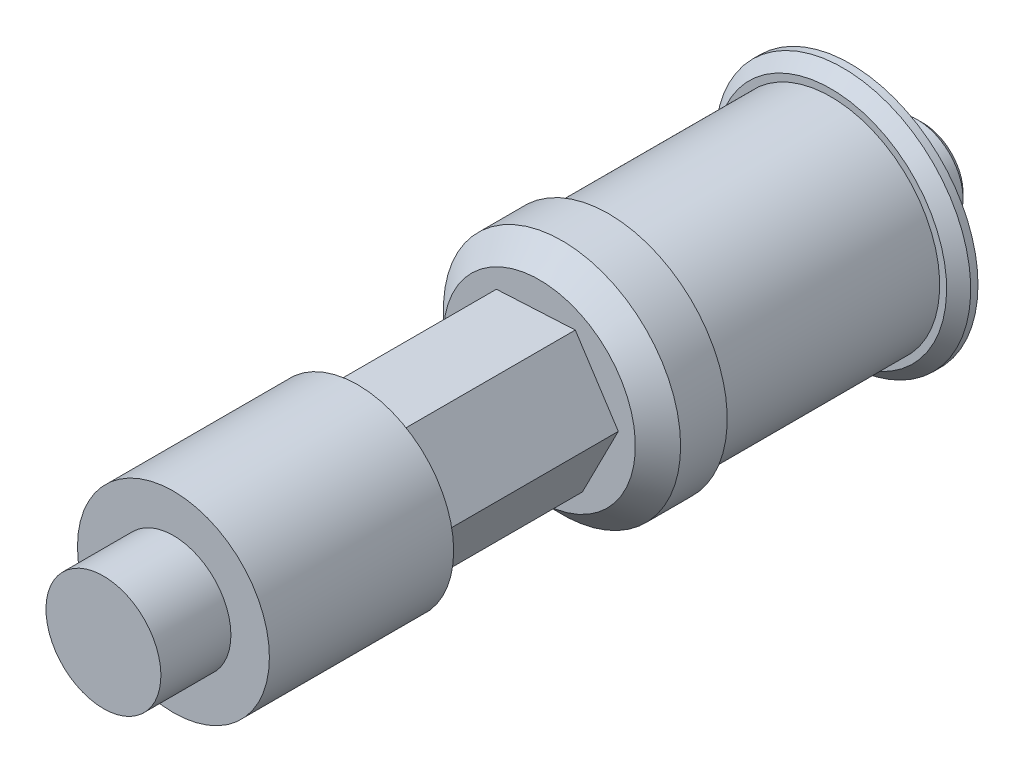
ISO-10303-21;
HEADER;
FILE_DESCRIPTION(('STEP AP214'),'2;1');
FILE_NAME('part.step','',(''),(''),'','','');
FILE_SCHEMA(('AUTOMOTIVE_DESIGN { 1 0 10303 214 1 1 1 1 }'));
ENDSEC;
DATA;
#1=APPLICATION_CONTEXT('core data for automotive mechanical design processes');
#2=APPLICATION_PROTOCOL_DEFINITION('international standard','automotive_design',2000,#1);
#3=PRODUCT_CONTEXT('',#1,'mechanical');
#4=PRODUCT('Part','Part','',(#3));
#5=PRODUCT_RELATED_PRODUCT_CATEGORY('part','',(#4));
#6=PRODUCT_DEFINITION_FORMATION('','',#4);
#7=PRODUCT_DEFINITION_CONTEXT('part definition',#1,'design');
#8=PRODUCT_DEFINITION('design','',#6,#7);
#9=PRODUCT_DEFINITION_SHAPE('','',#8);
#10=(LENGTH_UNIT() NAMED_UNIT(*) SI_UNIT(.MILLI.,.METRE.));
#11=(NAMED_UNIT(*) PLANE_ANGLE_UNIT() SI_UNIT($,.RADIAN.));
#12=(NAMED_UNIT(*) SI_UNIT($,.STERADIAN.) SOLID_ANGLE_UNIT());
#13=UNCERTAINTY_MEASURE_WITH_UNIT(LENGTH_MEASURE(1.E-05),#10,'distance_accuracy_value','');
#14=(GEOMETRIC_REPRESENTATION_CONTEXT(3) GLOBAL_UNCERTAINTY_ASSIGNED_CONTEXT((#13)) GLOBAL_UNIT_ASSIGNED_CONTEXT((#10,
#11,#12)) REPRESENTATION_CONTEXT('',''));
#15=CARTESIAN_POINT('',(0.,0.,0.));
#16=DIRECTION('',(0.,0.,1.));
#17=DIRECTION('',(1.,0.,0.));
#18=AXIS2_PLACEMENT_3D('',#15,#16,#17);
#19=CARTESIAN_POINT('',(-77.2504091626865,123.55655672875,3.32914742607242));
#20=DIRECTION('',(0.,0.,1.));
#21=DIRECTION('',(-0.998640809167126,-0.0521203824432134,0.));
#22=AXIS2_PLACEMENT_3D('',#19,#20,#21);
#23=CYLINDRICAL_SURFACE('',#22,4.699);
#24=CARTESIAN_POINT('',(-77.2504091626865,123.55655672875,39.3573));
#25=DIRECTION('',(0.,0.,-1.));
#26=DIRECTION('',(-0.998640809167126,-0.0521203824432134,0.));
#27=AXIS2_PLACEMENT_3D('',#24,#25,#26);
#28=CIRCLE('',#27,4.699);
#29=CARTESIAN_POINT('',(-81.9430223249628,123.311643051649,39.3573));
#30=VERTEX_POINT('',#29);
#31=EDGE_CURVE('E204',#30,#30,#28,.T.);
#32=ORIENTED_EDGE('',*,*,#31,.F.);
#33=EDGE_LOOP('',(#32));
#34=FACE_BOUND('',#33,.T.);
#35=CARTESIAN_POINT('',(-77.2504091626865,123.55655672875,39.5605));
#36=DIRECTION('',(0.,0.,1.));
#37=DIRECTION('',(1.,0.,0.));
#38=AXIS2_PLACEMENT_3D('',#35,#36,#37);
#39=CIRCLE('',#38,4.699);
#40=CARTESIAN_POINT('',(-72.5514091626865,123.55655672875,39.5605));
#41=VERTEX_POINT('',#40);
#42=EDGE_CURVE('E22',#41,#41,#39,.F.);
#43=ORIENTED_EDGE('',*,*,#42,.T.);
#44=EDGE_LOOP('',(#43));
#45=FACE_BOUND('',#44,.T.);
#46=ADVANCED_FACE('F18',(#34,#45),#23,.T.);
#47=CARTESIAN_POINT('',(-77.2504091626865,123.55655672875,22.0909));
#48=DIRECTION('',(0.,0.,1.));
#49=DIRECTION('',(-0.998640809167126,-0.0521203824432134,0.));
#50=AXIS2_PLACEMENT_3D('',#47,#48,#49);
#51=PLANE('',#50);
#52=CARTESIAN_POINT('',(-77.2504091626865,123.55655672875,22.0909));
#53=DIRECTION('',(0.,0.,-1.));
#54=DIRECTION('',(-0.998640809167126,-0.0521203824432134,0.));
#55=AXIS2_PLACEMENT_3D('',#52,#53,#54);
#56=CIRCLE('',#55,7.5692);
#57=CARTESIAN_POINT('',(-84.8093211754343,123.162047129961,22.0909));
#58=VERTEX_POINT('',#57);
#59=EDGE_CURVE('E187',#58,#58,#56,.T.);
#60=ORIENTED_EDGE('',*,*,#59,.F.);
#61=EDGE_LOOP('',(#60));
#62=FACE_BOUND('',#61,.T.);
#63=CARTESIAN_POINT('',(-77.2504091626865,123.55655672875,22.0909));
#64=DIRECTION('',(0.,0.,1.));
#65=DIRECTION('',(-0.998640809167126,-0.0521203824432134,0.));
#66=AXIS2_PLACEMENT_3D('',#63,#64,#65);
#67=CIRCLE('',#66,8.255);
#68=CARTESIAN_POINT('',(-85.4941890423611,123.126302971681,22.0909));
#69=VERTEX_POINT('',#68);
#70=EDGE_CURVE('E175',#69,#69,#67,.T.);
#71=ORIENTED_EDGE('',*,*,#70,.F.);
#72=EDGE_LOOP('',(#71));
#73=FACE_BOUND('',#72,.T.);
#74=ADVANCED_FACE('F270',(#62,#73),#51,.F.);
#75=CARTESIAN_POINT('',(-77.2504091626865,123.55655672875,57.260499906));
#76=DIRECTION('',(0.,0.,1.));
#77=DIRECTION('',(-0.998640809167126,-0.0521203824432134,0.));
#78=AXIS2_PLACEMENT_3D('',#75,#76,#77);
#79=CYLINDRICAL_SURFACE('',#78,8.255);
#80=CARTESIAN_POINT('',(-77.2504091626865,123.55655672875,25.3365));
#81=DIRECTION('',(0.,0.,1.));
#82=DIRECTION('',(0.0521203824432135,-0.998640809167127,0.));
#83=AXIS2_PLACEMENT_3D('',#80,#81,#82);
#84=CIRCLE('',#83,8.255);
#85=CARTESIAN_POINT('',(-76.8201554056178,115.312776849075,25.3365));
#86=VERTEX_POINT('',#85);
#87=EDGE_CURVE('E177',#86,#86,#84,.T.);
#88=ORIENTED_EDGE('',*,*,#87,.F.);
#89=EDGE_LOOP('',(#88));
#90=FACE_BOUND('',#89,.T.);
#91=ORIENTED_EDGE('',*,*,#70,.T.);
#92=EDGE_LOOP('',(#91));
#93=FACE_BOUND('',#92,.T.);
#94=ADVANCED_FACE('F262',(#90,#93),#79,.T.);
#95=CARTESIAN_POINT('',(-77.2504091626865,123.55655672875,25.3365));
#96=DIRECTION('',(0.,0.,-1.));
#97=DIRECTION('',(-0.0521203824432135,0.998640809167127,0.));
#98=AXIS2_PLACEMENT_3D('',#95,#96,#97);
#99=CONICAL_SURFACE('',#98,8.255,0.785398163397449);
#100=ORIENTED_EDGE('',*,*,#87,.T.);
#101=EDGE_LOOP('',(#100));
#102=FACE_BOUND('',#101,.T.);
#103=CARTESIAN_POINT('',(-77.2504091626865,123.55655672875,26.9113));
#104=DIRECTION('',(0.,0.,1.));
#105=DIRECTION('',(0.0521203824432135,-0.998640809167127,0.));
#106=AXIS2_PLACEMENT_3D('',#103,#104,#105);
#107=CIRCLE('',#106,6.6802);
#108=CARTESIAN_POINT('',(-76.9022345838893,116.885436395352,26.9113));
#109=VERTEX_POINT('',#108);
#110=EDGE_CURVE('E182',#109,#109,#107,.T.);
#111=ORIENTED_EDGE('',*,*,#110,.F.);
#112=EDGE_LOOP('',(#111));
#113=FACE_BOUND('',#112,.T.);
#114=ADVANCED_FACE('F259',(#102,#113),#99,.T.);
#115=CARTESIAN_POINT('',(-74.1896879220587,119.074490707315,3.32914742607242));
#116=DIRECTION('',(0.890908501216186,-0.45418282933278,0.));
#117=DIRECTION('',(0.45418282933278,0.890908501216187,0.));
#118=AXIS2_PLACEMENT_3D('',#115,#116,#117);
#119=PLANE('',#118);
#120=DIRECTION('',(-0.45418282933278,-0.890908501216187,0.));
#121=VECTOR('',#120,1.);
#122=CARTESIAN_POINT('',(-74.1896879220587,119.074490707315,26.9113));
#123=LINE('',#122,#121);
#124=CARTESIAN_POINT('',(-71.7586223942209,123.843180331592,26.9113));
#125=VERTEX_POINT('',#124);
#126=CARTESIAN_POINT('',(-74.2562924570679,118.943841676513,26.9113));
#127=VERTEX_POINT('',#126);
#128=EDGE_CURVE('E44',#125,#127,#123,.T.);
#129=ORIENTED_EDGE('',*,*,#128,.F.);
#130=DIRECTION('',(0.,0.,-1.));
#131=VECTOR('',#130,1.);
#132=CARTESIAN_POINT('',(-71.7586223942209,123.843180331592,3.32914742607242));
#133=LINE('',#132,#131);
#134=CARTESIAN_POINT('',(-71.7586223942209,123.843180331592,39.3573));
#135=VERTEX_POINT('',#134);
#136=EDGE_CURVE('E123',#125,#135,#133,.F.);
#137=ORIENTED_EDGE('',*,*,#136,.T.);
#138=DIRECTION('',(-0.45418282933278,-0.890908501216187,0.));
#139=VECTOR('',#138,1.);
#140=CARTESIAN_POINT('',(-74.1896879220587,119.074490707315,39.3573));
#141=LINE('',#140,#139);
#142=CARTESIAN_POINT('',(-74.2562924570679,118.943841676513,39.3573));
#143=VERTEX_POINT('',#142);
#144=EDGE_CURVE('E36',#135,#143,#141,.T.);
#145=ORIENTED_EDGE('',*,*,#144,.T.);
#146=DIRECTION('',(0.,0.,-1.));
#147=VECTOR('',#146,1.);
#148=CARTESIAN_POINT('',(-74.2562924570679,118.943841676513,3.32914742607242));
#149=LINE('',#148,#147);
#150=EDGE_CURVE('E128',#127,#143,#149,.F.);
#151=ORIENTED_EDGE('',*,*,#150,.F.);
#152=EDGE_LOOP('',(#129,#137,#145,#151));
#153=FACE_BOUND('',#152,.T.);
#154=ADVANCED_FACE('F261',(#153),#119,.T.);
#155=CARTESIAN_POINT('',(-83.3381235353693,123.238830877376,26.9113));
#156=DIRECTION('',(0.,0.,1.));
#157=DIRECTION('',(-0.998640809167126,-0.0521203824432134,0.));
#158=AXIS2_PLACEMENT_3D('',#155,#156,#157);
#159=PLANE('',#158);
#160=ORIENTED_EDGE('',*,*,#110,.T.);
#161=EDGE_LOOP('',(#160));
#162=FACE_BOUND('',#161,.T.);
#163=DIRECTION('',(-0.544457979834346,0.838788118772973,0.));
#164=VECTOR('',#163,1.);
#165=CARTESIAN_POINT('',(-82.6623528190023,123.146927391181,26.9113));
#166=LINE('',#165,#164);
#167=CARTESIAN_POINT('',(-79.7480792255335,118.65721807367,26.9113));
#168=VERTEX_POINT('',#167);
#169=CARTESIAN_POINT('',(-82.7421959311521,123.269933125907,26.9113));
#170=VERTEX_POINT('',#169);
#171=EDGE_CURVE('E77',#168,#170,#166,.T.);
#172=ORIENTED_EDGE('',*,*,#171,.T.);
#173=DIRECTION('',(0.45418282933278,0.890908501216187,0.));
#174=VECTOR('',#173,1.);
#175=CARTESIAN_POINT('',(-80.3111304033144,128.038622750185,26.9113));
#176=LINE('',#175,#174);
#177=CARTESIAN_POINT('',(-80.2445258683051,128.169271780987,26.9113));
#178=VERTEX_POINT('',#177);
#179=EDGE_CURVE('E93',#170,#178,#176,.T.);
#180=ORIENTED_EDGE('',*,*,#179,.T.);
#181=DIRECTION('',(0.998640809167126,0.0521203824432137,0.));
#182=VECTOR('',#181,1.);
#183=CARTESIAN_POINT('',(-74.8991867469986,128.448252087754,26.9113));
#184=LINE('',#183,#182);
#185=CARTESIAN_POINT('',(-74.7527390998395,128.45589538383,26.9113));
#186=VERTEX_POINT('',#185);
#187=EDGE_CURVE('E237',#178,#186,#184,.T.);
#188=ORIENTED_EDGE('',*,*,#187,.T.);
#189=DIRECTION('',(0.544457979834346,-0.838788118772973,0.));
#190=VECTOR('',#189,1.);
#191=CARTESIAN_POINT('',(-71.8384655063708,123.966186066319,26.9113));
#192=LINE('',#191,#190);
#193=EDGE_CURVE('E242',#186,#125,#192,.T.);
#194=ORIENTED_EDGE('',*,*,#193,.T.);
#195=ORIENTED_EDGE('',*,*,#128,.T.);
#196=DIRECTION('',(-0.998640809167126,-0.0521203824432132,0.));
#197=VECTOR('',#196,1.);
#198=CARTESIAN_POINT('',(-79.6016315783744,118.664861369746,26.9113));
#199=LINE('',#198,#197);
#200=EDGE_CURVE('E74',#127,#168,#199,.T.);
#201=ORIENTED_EDGE('',*,*,#200,.T.);
#202=EDGE_LOOP('',(#172,#180,#188,#194,#195,#201));
#203=FACE_BOUND('',#202,.T.);
#204=ADVANCED_FACE('F76',(#162,#203),#159,.T.);
#205=CARTESIAN_POINT('',(-79.6016315783744,118.664861369746,3.32914742607242));
#206=DIRECTION('',(0.0521203824432133,-0.998640809167127,0.));
#207=DIRECTION('',(0.998640809167126,0.0521203824432132,0.));
#208=AXIS2_PLACEMENT_3D('',#205,#206,#207);
#209=PLANE('',#208);
#210=ORIENTED_EDGE('',*,*,#200,.F.);
#211=ORIENTED_EDGE('',*,*,#150,.T.);
#212=DIRECTION('',(-0.998640809167126,-0.0521203824432132,0.));
#213=VECTOR('',#212,1.);
#214=CARTESIAN_POINT('',(-79.6016315783744,118.664861369746,39.3573));
#215=LINE('',#214,#213);
#216=CARTESIAN_POINT('',(-79.7480792255335,118.65721807367,39.3573));
#217=VERTEX_POINT('',#216);
#218=EDGE_CURVE('E96',#143,#217,#215,.T.);
#219=ORIENTED_EDGE('',*,*,#218,.T.);
#220=DIRECTION('',(0.,0.,-1.));
#221=VECTOR('',#220,1.);
#222=CARTESIAN_POINT('',(-79.7480792255335,118.65721807367,3.32914742607242));
#223=LINE('',#222,#221);
#224=EDGE_CURVE('E89',#168,#217,#223,.F.);
#225=ORIENTED_EDGE('',*,*,#224,.F.);
#226=EDGE_LOOP('',(#210,#211,#219,#225));
#227=FACE_BOUND('',#226,.T.);
#228=ADVANCED_FACE('F95',(#227),#209,.T.);
#229=CARTESIAN_POINT('',(-83.3381235353693,123.238830877376,39.3573));
#230=DIRECTION('',(0.,0.,1.));
#231=DIRECTION('',(-0.998640809167126,-0.0521203824432134,0.));
#232=AXIS2_PLACEMENT_3D('',#229,#230,#231);
#233=PLANE('',#232);
#234=ORIENTED_EDGE('',*,*,#31,.T.);
#235=EDGE_LOOP('',(#234));
#236=FACE_BOUND('',#235,.T.);
#237=DIRECTION('',(-0.544457979834346,0.838788118772973,0.));
#238=VECTOR('',#237,1.);
#239=CARTESIAN_POINT('',(-82.6623528190022,123.146927391181,39.3573));
#240=LINE('',#239,#238);
#241=CARTESIAN_POINT('',(-82.7421959311521,123.269933125907,39.3573));
#242=VERTEX_POINT('',#241);
#243=EDGE_CURVE('E83',#217,#242,#240,.T.);
#244=ORIENTED_EDGE('',*,*,#243,.F.);
#245=ORIENTED_EDGE('',*,*,#218,.F.);
#246=ORIENTED_EDGE('',*,*,#144,.F.);
#247=DIRECTION('',(0.544457979834346,-0.838788118772973,0.));
#248=VECTOR('',#247,1.);
#249=CARTESIAN_POINT('',(-71.8384655063708,123.966186066319,39.3573));
#250=LINE('',#249,#248);
#251=CARTESIAN_POINT('',(-74.7527390998395,128.45589538383,39.3573));
#252=VERTEX_POINT('',#251);
#253=EDGE_CURVE('E212',#252,#135,#250,.T.);
#254=ORIENTED_EDGE('',*,*,#253,.F.);
#255=DIRECTION('',(0.998640809167126,0.0521203824432137,0.));
#256=VECTOR('',#255,1.);
#257=CARTESIAN_POINT('',(-74.8991867469986,128.448252087754,39.3573));
#258=LINE('',#257,#256);
#259=CARTESIAN_POINT('',(-80.2445258683051,128.169271780987,39.3573));
#260=VERTEX_POINT('',#259);
#261=EDGE_CURVE('E217',#260,#252,#258,.T.);
#262=ORIENTED_EDGE('',*,*,#261,.F.);
#263=DIRECTION('',(0.45418282933278,0.890908501216187,0.));
#264=VECTOR('',#263,1.);
#265=CARTESIAN_POINT('',(-80.3111304033144,128.038622750185,39.3573));
#266=LINE('',#265,#264);
#267=EDGE_CURVE('E222',#242,#260,#266,.T.);
#268=ORIENTED_EDGE('',*,*,#267,.F.);
#269=EDGE_LOOP('',(#244,#245,#246,#254,#262,#268));
#270=FACE_BOUND('',#269,.T.);
#271=ADVANCED_FACE('F284',(#236,#270),#233,.T.);
#272=CARTESIAN_POINT('',(-82.6623528190022,123.146927391181,3.32914742607242));
#273=DIRECTION('',(-0.838788118772972,-0.544457979834347,0.));
#274=DIRECTION('',(0.544457979834346,-0.838788118772973,0.));
#275=AXIS2_PLACEMENT_3D('',#272,#273,#274);
#276=PLANE('',#275);
#277=ORIENTED_EDGE('',*,*,#171,.F.);
#278=ORIENTED_EDGE('',*,*,#224,.T.);
#279=ORIENTED_EDGE('',*,*,#243,.T.);
#280=DIRECTION('',(0.,0.,-1.));
#281=VECTOR('',#280,1.);
#282=CARTESIAN_POINT('',(-82.7421959311521,123.269933125907,3.32914742607242));
#283=LINE('',#282,#281);
#284=EDGE_CURVE('E91',#170,#242,#283,.F.);
#285=ORIENTED_EDGE('',*,*,#284,.F.);
#286=EDGE_LOOP('',(#277,#278,#279,#285));
#287=FACE_BOUND('',#286,.T.);
#288=ADVANCED_FACE('F87',(#287),#276,.T.);
#289=CARTESIAN_POINT('',(-80.3111304033143,128.038622750185,3.32914742607242));
#290=DIRECTION('',(-0.890908501216186,0.45418282933278,0.));
#291=DIRECTION('',(-0.45418282933278,-0.890908501216187,0.));
#292=AXIS2_PLACEMENT_3D('',#289,#290,#291);
#293=PLANE('',#292);
#294=ORIENTED_EDGE('',*,*,#179,.F.);
#295=ORIENTED_EDGE('',*,*,#284,.T.);
#296=ORIENTED_EDGE('',*,*,#267,.T.);
#297=DIRECTION('',(0.,0.,-1.));
#298=VECTOR('',#297,1.);
#299=CARTESIAN_POINT('',(-80.2445258683051,128.169271780987,3.32914742607242));
#300=LINE('',#299,#298);
#301=EDGE_CURVE('E104',#178,#260,#300,.F.);
#302=ORIENTED_EDGE('',*,*,#301,.F.);
#303=EDGE_LOOP('',(#294,#295,#296,#302));
#304=FACE_BOUND('',#303,.T.);
#305=ADVANCED_FACE('F298',(#304),#293,.T.);
#306=CARTESIAN_POINT('',(-74.8991867469986,128.448252087754,3.32914742607242));
#307=DIRECTION('',(-0.0521203824432138,0.998640809167127,0.));
#308=DIRECTION('',(-0.998640809167126,-0.0521203824432137,0.));
#309=AXIS2_PLACEMENT_3D('',#306,#307,#308);
#310=PLANE('',#309);
#311=ORIENTED_EDGE('',*,*,#187,.F.);
#312=ORIENTED_EDGE('',*,*,#301,.T.);
#313=ORIENTED_EDGE('',*,*,#261,.T.);
#314=DIRECTION('',(0.,0.,-1.));
#315=VECTOR('',#314,1.);
#316=CARTESIAN_POINT('',(-74.7527390998395,128.45589538383,3.32914742607242));
#317=LINE('',#316,#315);
#318=EDGE_CURVE('E117',#186,#252,#317,.F.);
#319=ORIENTED_EDGE('',*,*,#318,.F.);
#320=EDGE_LOOP('',(#311,#312,#313,#319));
#321=FACE_BOUND('',#320,.T.);
#322=ADVANCED_FACE('F294',(#321),#310,.T.);
#323=CARTESIAN_POINT('',(-71.8384655063708,123.966186066319,3.32914742607242));
#324=DIRECTION('',(0.838788118772972,0.544457979834347,0.));
#325=DIRECTION('',(-0.544457979834346,0.838788118772973,0.));
#326=AXIS2_PLACEMENT_3D('',#323,#324,#325);
#327=PLANE('',#326);
#328=ORIENTED_EDGE('',*,*,#193,.F.);
#329=ORIENTED_EDGE('',*,*,#318,.T.);
#330=ORIENTED_EDGE('',*,*,#253,.T.);
#331=ORIENTED_EDGE('',*,*,#136,.F.);
#332=EDGE_LOOP('',(#328,#329,#330,#331));
#333=FACE_BOUND('',#332,.T.);
#334=ADVANCED_FACE('F290',(#333),#327,.T.);
#335=CARTESIAN_POINT('',(-77.2504091626865,123.55655672875,0.215900000000019));
#336=DIRECTION('',(0.,0.,1.));
#337=DIRECTION('',(-0.998640809167126,-0.0521203824432134,0.));
#338=AXIS2_PLACEMENT_3D('',#335,#336,#337);
#339=CYLINDRICAL_SURFACE('',#338,7.5692);
#340=ORIENTED_EDGE('',*,*,#59,.T.);
#341=EDGE_LOOP('',(#340));
#342=FACE_BOUND('',#341,.T.);
#343=CARTESIAN_POINT('',(-77.2504091626865,123.55655672875,6.6167));
#344=DIRECTION('',(0.,0.,1.));
#345=DIRECTION('',(0.998640809167126,0.052120382443209,0.));
#346=AXIS2_PLACEMENT_3D('',#343,#344,#345);
#347=CIRCLE('',#346,7.5692);
#348=CARTESIAN_POINT('',(-69.6914971499387,123.951066327539,6.6167));
#349=VERTEX_POINT('',#348);
#350=EDGE_CURVE('E183',#349,#349,#347,.T.);
#351=ORIENTED_EDGE('',*,*,#350,.T.);
#352=EDGE_LOOP('',(#351));
#353=FACE_BOUND('',#352,.T.);
#354=ADVANCED_FACE('F293',(#342,#353),#339,.T.);
#355=CARTESIAN_POINT('',(-85.2912652299384,123.136893833394,6.6167));
#356=DIRECTION('',(0.,0.,-1.));
#357=DIRECTION('',(-0.0521203824432135,0.998640809167127,0.));
#358=AXIS2_PLACEMENT_3D('',#355,#356,#357);
#359=PLANE('',#358);
#360=ORIENTED_EDGE('',*,*,#350,.F.);
#361=EDGE_LOOP('',(#360));
#362=FACE_BOUND('',#361,.T.);
#363=CARTESIAN_POINT('',(-77.2504091626865,123.55655672875,6.6167));
#364=DIRECTION('',(0.,0.,-1.));
#365=DIRECTION('',(-0.0521203824432135,0.998640809167127,0.));
#366=AXIS2_PLACEMENT_3D('',#363,#364,#365);
#367=CIRCLE('',#366,8.0518);
#368=CARTESIAN_POINT('',(-77.6700720580428,131.597412796002,6.6167));
#369=VERTEX_POINT('',#368);
#370=EDGE_CURVE('E155',#369,#369,#367,.T.);
#371=ORIENTED_EDGE('',*,*,#370,.F.);
#372=EDGE_LOOP('',(#371));
#373=FACE_BOUND('',#372,.T.);
#374=ADVANCED_FACE('F366',(#362,#373),#359,.F.);
#375=CARTESIAN_POINT('',(-77.2504091626865,123.55655672875,6.6167));
#376=DIRECTION('',(0.,0.,-1.));
#377=DIRECTION('',(-0.0521203824432135,0.998640809167127,0.));
#378=AXIS2_PLACEMENT_3D('',#375,#376,#377);
#379=CONICAL_SURFACE('',#378,8.0518,0.78539816339745);
#380=CARTESIAN_POINT('',(-77.2504091626865,123.55655672875,5.7785));
#381=DIRECTION('',(0.,0.,-1.));
#382=DIRECTION('',(-0.0521203824432135,0.998640809167127,0.));
#383=AXIS2_PLACEMENT_3D('',#380,#381,#382);
#384=CIRCLE('',#383,8.89);
#385=CARTESIAN_POINT('',(-77.7137593626067,132.434473522246,5.7785));
#386=VERTEX_POINT('',#385);
#387=EDGE_CURVE('E152',#386,#386,#384,.T.);
#388=ORIENTED_EDGE('',*,*,#387,.F.);
#389=EDGE_LOOP('',(#388));
#390=FACE_BOUND('',#389,.T.);
#391=ORIENTED_EDGE('',*,*,#370,.T.);
#392=EDGE_LOOP('',(#391));
#393=FACE_BOUND('',#392,.T.);
#394=ADVANCED_FACE('F149',(#390,#393),#379,.T.);
#395=CARTESIAN_POINT('',(-77.2504091626865,123.55655672875,4.7625));
#396=DIRECTION('',(0.,0.,-1.));
#397=DIRECTION('',(-0.0521203824432135,0.998640809167127,0.));
#398=AXIS2_PLACEMENT_3D('',#395,#396,#397);
#399=CYLINDRICAL_SURFACE('',#398,8.89);
#400=CARTESIAN_POINT('',(-77.2504091626865,123.55655672875,5.2705));
#401=DIRECTION('',(0.,0.,1.));
#402=DIRECTION('',(1.,0.,0.));
#403=AXIS2_PLACEMENT_3D('',#400,#401,#402);
#404=CIRCLE('',#403,8.89);
#405=CARTESIAN_POINT('',(-68.3604091626865,123.55655672875,5.2705));
#406=VERTEX_POINT('',#405);
#407=EDGE_CURVE('E29',#406,#406,#404,.F.);
#408=ORIENTED_EDGE('',*,*,#407,.F.);
#409=EDGE_LOOP('',(#408));
#410=FACE_BOUND('',#409,.T.);
#411=ORIENTED_EDGE('',*,*,#387,.T.);
#412=EDGE_LOOP('',(#411));
#413=FACE_BOUND('',#412,.T.);
#414=ADVANCED_FACE('F146',(#410,#413),#399,.T.);
#415=CARTESIAN_POINT('',(-81.6893675594344,123.32488162879,5.2705));
#416=DIRECTION('',(0.,0.,1.));
#417=DIRECTION('',(0.0521203824432135,-0.998640809167127,0.));
#418=AXIS2_PLACEMENT_3D('',#415,#416,#417);
#419=PLANE('',#418);
#420=CARTESIAN_POINT('',(-77.2504091626865,123.55655672875,5.2705));
#421=DIRECTION('',(0.,0.,-1.));
#422=DIRECTION('',(-0.0521203824432135,0.998640809167127,0.));
#423=AXIS2_PLACEMENT_3D('',#420,#421,#422);
#424=CIRCLE('',#423,4.445);
#425=CARTESIAN_POINT('',(-77.4820842626466,127.995515125498,5.2705));
#426=VERTEX_POINT('',#425);
#427=EDGE_CURVE('E154',#426,#426,#424,.T.);
#428=ORIENTED_EDGE('',*,*,#427,.F.);
#429=EDGE_LOOP('',(#428));
#430=FACE_BOUND('',#429,.T.);
#431=ORIENTED_EDGE('',*,*,#407,.T.);
#432=EDGE_LOOP('',(#431));
#433=FACE_BOUND('',#432,.T.);
#434=ADVANCED_FACE('F20',(#430,#433),#419,.F.);
#435=CARTESIAN_POINT('',(-77.2504091626865,123.55655672875,4.7625));
#436=DIRECTION('',(0.,0.,-1.));
#437=DIRECTION('',(-0.0521203824432135,0.998640809167127,0.));
#438=AXIS2_PLACEMENT_3D('',#435,#436,#437);
#439=CYLINDRICAL_SURFACE('',#438,4.445);
#440=CARTESIAN_POINT('',(-77.2504091626865,123.55655672875,4.7625));
#441=DIRECTION('',(0.,0.,-1.));
#442=DIRECTION('',(-0.0521203824432135,0.998640809167127,0.));
#443=AXIS2_PLACEMENT_3D('',#440,#441,#442);
#444=CIRCLE('',#443,4.445);
#445=CARTESIAN_POINT('',(-77.4820842626466,127.995515125498,4.7625));
#446=VERTEX_POINT('',#445);
#447=EDGE_CURVE('E160',#446,#446,#444,.T.);
#448=ORIENTED_EDGE('',*,*,#447,.F.);
#449=EDGE_LOOP('',(#448));
#450=FACE_BOUND('',#449,.T.);
#451=ORIENTED_EDGE('',*,*,#427,.T.);
#452=EDGE_LOOP('',(#451));
#453=FACE_BOUND('',#452,.T.);
#454=ADVANCED_FACE('F375',(#450,#453),#439,.T.);
#455=CARTESIAN_POINT('',(-77.2504091626865,123.55655672875,0.215900000000019));
#456=DIRECTION('',(0.,0.,-1.));
#457=DIRECTION('',(0.998640809167126,0.0521203824432134,0.));
#458=AXIS2_PLACEMENT_3D('',#455,#456,#457);
#459=PLANE('',#458);
#460=CARTESIAN_POINT('',(-77.2504091626865,123.55655672875,0.215900000000019));
#461=DIRECTION('',(0.,0.,-1.));
#462=DIRECTION('',(0.998640809167126,0.0521203824432134,0.));
#463=AXIS2_PLACEMENT_3D('',#460,#461,#462);
#464=CIRCLE('',#463,2.794);
#465=CARTESIAN_POINT('',(-74.4602067418735,123.702181077296,0.215900000000019));
#466=VERTEX_POINT('',#465);
#467=EDGE_CURVE('E176',#466,#466,#464,.T.);
#468=ORIENTED_EDGE('',*,*,#467,.T.);
#469=EDGE_LOOP('',(#468));
#470=FACE_BOUND('',#469,.T.);
#471=ADVANCED_FACE('F372',(#470),#459,.T.);
#472=CARTESIAN_POINT('',(-77.2504091626865,123.55655672875,0.596900000000011));
#473=DIRECTION('',(0.,0.,1.));
#474=DIRECTION('',(-0.998640809167126,-0.0521203824432134,0.));
#475=AXIS2_PLACEMENT_3D('',#472,#473,#474);
#476=CONICAL_SURFACE('',#475,3.175,0.785398163397434);
#477=CARTESIAN_POINT('',(-77.2504091626865,123.55655672875,0.596900000000011));
#478=DIRECTION('',(0.,0.,1.));
#479=DIRECTION('',(0.998640809167126,0.0521203824432134,0.));
#480=AXIS2_PLACEMENT_3D('',#477,#478,#479);
#481=CIRCLE('',#480,3.175);
#482=CARTESIAN_POINT('',(-74.0797245935809,123.722038943007,0.596900000000011));
#483=VERTEX_POINT('',#482);
#484=EDGE_CURVE('E181',#483,#483,#481,.T.);
#485=ORIENTED_EDGE('',*,*,#484,.F.);
#486=EDGE_LOOP('',(#485));
#487=FACE_BOUND('',#486,.T.);
#488=ORIENTED_EDGE('',*,*,#467,.F.);
#489=EDGE_LOOP('',(#488));
#490=FACE_BOUND('',#489,.T.);
#491=ADVANCED_FACE('F374',(#487,#490),#476,.T.);
#492=CARTESIAN_POINT('',(-77.2504091626865,123.55655672875,57.260499906));
#493=DIRECTION('',(0.,0.,1.));
#494=DIRECTION('',(-0.998640809167126,-0.0521203824432134,0.));
#495=AXIS2_PLACEMENT_3D('',#492,#493,#494);
#496=CYLINDRICAL_SURFACE('',#495,3.175);
#497=CARTESIAN_POINT('',(-77.2504091626865,123.55655672875,4.7625));
#498=DIRECTION('',(0.,0.,1.));
#499=DIRECTION('',(0.998640809167126,0.0521203824432134,0.));
#500=AXIS2_PLACEMENT_3D('',#497,#498,#499);
#501=CIRCLE('',#500,3.175);
#502=CARTESIAN_POINT('',(-74.0797245935809,123.722038943007,4.7625));
#503=VERTEX_POINT('',#502);
#504=EDGE_CURVE('E194',#503,#503,#501,.T.);
#505=ORIENTED_EDGE('',*,*,#504,.F.);
#506=EDGE_LOOP('',(#505));
#507=FACE_BOUND('',#506,.T.);
#508=ORIENTED_EDGE('',*,*,#484,.T.);
#509=EDGE_LOOP('',(#508));
#510=FACE_BOUND('',#509,.T.);
#511=ADVANCED_FACE('F371',(#507,#510),#496,.T.);
#512=CARTESIAN_POINT('',(-77.2504091626865,123.55655672875,4.7625));
#513=DIRECTION('',(0.,0.,-1.));
#514=DIRECTION('',(0.998640809167126,0.0521203824432134,0.));
#515=AXIS2_PLACEMENT_3D('',#512,#513,#514);
#516=PLANE('',#515);
#517=ORIENTED_EDGE('',*,*,#447,.T.);
#518=EDGE_LOOP('',(#517));
#519=FACE_BOUND('',#518,.T.);
#520=ORIENTED_EDGE('',*,*,#504,.T.);
#521=EDGE_LOOP('',(#520));
#522=FACE_BOUND('',#521,.T.);
#523=ADVANCED_FACE('F325',(#519,#522),#516,.T.);
#524=CARTESIAN_POINT('',(-56.134,158.369,52.3875));
#525=DIRECTION('',(0.,0.,1.));
#526=DIRECTION('',(0.,-1.,0.));
#527=AXIS2_PLACEMENT_3D('',#524,#525,#526);
#528=PLANE('',#527);
#529=CARTESIAN_POINT('',(-77.2504091626865,123.55655672875,52.3875));
#530=DIRECTION('',(0.,0.,1.));
#531=DIRECTION('',(1.,0.,0.));
#532=AXIS2_PLACEMENT_3D('',#529,#530,#531);
#533=CIRCLE('',#532,4.000000001);
#534=CARTESIAN_POINT('',(-73.2504091616865,123.55655672875,52.3875));
#535=VERTEX_POINT('',#534);
#536=EDGE_CURVE('E11',#535,#535,#533,.F.);
#537=ORIENTED_EDGE('',*,*,#536,.T.);
#538=EDGE_LOOP('',(#537));
#539=FACE_BOUND('',#538,.T.);
#540=CARTESIAN_POINT('',(-77.2504091626865,123.55655672875,52.3875));
#541=DIRECTION('',(0.,0.,1.));
#542=DIRECTION('',(1.,0.,0.));
#543=AXIS2_PLACEMENT_3D('',#540,#541,#542);
#544=CIRCLE('',#543,6.6802);
#545=CARTESIAN_POINT('',(-70.5702091626865,123.55655672875,52.3875));
#546=VERTEX_POINT('',#545);
#547=EDGE_CURVE('E329',#546,#546,#544,.T.);
#548=ORIENTED_EDGE('',*,*,#547,.T.);
#549=EDGE_LOOP('',(#548));
#550=FACE_BOUND('',#549,.T.);
#551=ADVANCED_FACE('F313',(#539,#550),#528,.T.);
#552=CARTESIAN_POINT('',(-77.2504091626865,123.55655672875,52.3895));
#553=DIRECTION('',(0.,0.,-1.));
#554=DIRECTION('',(-1.,0.,0.));
#555=AXIS2_PLACEMENT_3D('',#552,#553,#554);
#556=CYLINDRICAL_SURFACE('',#555,6.6802);
#557=CARTESIAN_POINT('',(-77.2504091626865,123.55655672875,39.5605));
#558=DIRECTION('',(0.,0.,1.));
#559=DIRECTION('',(1.,0.,0.));
#560=AXIS2_PLACEMENT_3D('',#557,#558,#559);
#561=CIRCLE('',#560,6.6802);
#562=CARTESIAN_POINT('',(-70.5702091626865,123.55655672875,39.5605));
#563=VERTEX_POINT('',#562);
#564=EDGE_CURVE('E332',#563,#563,#561,.T.);
#565=ORIENTED_EDGE('',*,*,#564,.T.);
#566=EDGE_LOOP('',(#565));
#567=FACE_BOUND('',#566,.T.);
#568=ORIENTED_EDGE('',*,*,#547,.F.);
#569=EDGE_LOOP('',(#568));
#570=FACE_BOUND('',#569,.T.);
#571=ADVANCED_FACE('F324',(#567,#570),#556,.T.);
#572=CARTESIAN_POINT('',(-77.2504091626865,123.55655672875,39.5605));
#573=DIRECTION('',(0.,0.,1.));
#574=DIRECTION('',(1.,0.,0.));
#575=AXIS2_PLACEMENT_3D('',#572,#573,#574);
#576=PLANE('',#575);
#577=ORIENTED_EDGE('',*,*,#42,.F.);
#578=EDGE_LOOP('',(#577));
#579=FACE_BOUND('',#578,.T.);
#580=ORIENTED_EDGE('',*,*,#564,.F.);
#581=EDGE_LOOP('',(#580));
#582=FACE_BOUND('',#581,.T.);
#583=ADVANCED_FACE('F311',(#579,#582),#576,.F.);
#584=CARTESIAN_POINT('',(-77.2504091626865,123.55655672875,57.260499906));
#585=DIRECTION('',(0.,0.,1.));
#586=DIRECTION('',(-0.998640809167126,-0.0521203824432134,0.));
#587=AXIS2_PLACEMENT_3D('',#584,#585,#586);
#588=PLANE('',#587);
#589=CARTESIAN_POINT('',(-77.2504091626865,123.55655672875,57.260499906));
#590=DIRECTION('',(0.,0.,1.));
#591=DIRECTION('',(0.,-1.,0.));
#592=AXIS2_PLACEMENT_3D('',#589,#590,#591);
#593=CIRCLE('',#592,4.000000001);
#594=CARTESIAN_POINT('',(-77.2504091626865,119.55655672775,57.260499906));
#595=VERTEX_POINT('',#594);
#596=EDGE_CURVE('E133',#595,#595,#593,.T.);
#597=ORIENTED_EDGE('',*,*,#596,.T.);
#598=EDGE_LOOP('',(#597));
#599=FACE_BOUND('',#598,.T.);
#600=ADVANCED_FACE('F307',(#599),#588,.T.);
#601=CARTESIAN_POINT('',(-77.2504091626865,123.55655672875,57.260499906));
#602=DIRECTION('',(0.,0.,1.));
#603=DIRECTION('',(-0.998640809167126,-0.0521203824432134,0.));
#604=AXIS2_PLACEMENT_3D('',#601,#602,#603);
#605=CYLINDRICAL_SURFACE('',#604,4.000000001);
#606=ORIENTED_EDGE('',*,*,#536,.F.);
#607=EDGE_LOOP('',(#606));
#608=FACE_BOUND('',#607,.T.);
#609=ORIENTED_EDGE('',*,*,#596,.F.);
#610=EDGE_LOOP('',(#609));
#611=FACE_BOUND('',#610,.T.);
#612=ADVANCED_FACE('F310',(#608,#611),#605,.T.);
#613=CLOSED_SHELL('',(#46,#74,#94,#114,#154,#204,#228,#271,#288,#305,#322,#334,#354,#374,#394,
#414,#434,#454,#471,#491,#511,#523,#551,#571,#583,#600,#612));
#614=CARTESIAN_POINT('',(-77.2504091626865,123.55655672875,4.7625));
#615=DIRECTION('',(0.,0.,1.));
#616=DIRECTION('',(-0.998640809167126,-0.0521203824432134,0.));
#617=AXIS2_PLACEMENT_3D('',#614,#615,#616);
#618=CYLINDRICAL_SURFACE('',#617,3.2385);
#619=CARTESIAN_POINT('',(-77.2504091626865,123.55655672875,6.6167));
#620=DIRECTION('',(0.,0.,-1.));
#621=DIRECTION('',(0.998640809167126,0.0521203824432134,0.));
#622=AXIS2_PLACEMENT_3D('',#619,#620,#621);
#623=CIRCLE('',#622,3.2385);
#624=CARTESIAN_POINT('',(-74.0163109021988,123.725348587292,6.6167));
#625=VERTEX_POINT('',#624);
#626=EDGE_CURVE('E171',#625,#625,#623,.T.);
#627=ORIENTED_EDGE('',*,*,#626,.T.);
#628=EDGE_LOOP('',(#627));
#629=FACE_BOUND('',#628,.T.);
#630=CARTESIAN_POINT('',(-77.2504091626865,123.55655672875,6.5024));
#631=DIRECTION('',(0.,0.,1.));
#632=DIRECTION('',(-1.,0.,0.));
#633=AXIS2_PLACEMENT_3D('',#630,#631,#632);
#634=CIRCLE('',#633,3.2385);
#635=CARTESIAN_POINT('',(-80.4889091626865,123.55655672875,6.5024));
#636=VERTEX_POINT('',#635);
#637=EDGE_CURVE('E108',#636,#636,#634,.T.);
#638=ORIENTED_EDGE('',*,*,#637,.T.);
#639=EDGE_LOOP('',(#638));
#640=FACE_BOUND('',#639,.T.);
#641=ADVANCED_FACE('F346',(#629,#640),#618,.T.);
#642=CARTESIAN_POINT('',(-85.4941890423611,123.126302971681,6.6167));
#643=DIRECTION('',(0.,0.,-1.));
#644=DIRECTION('',(0.998640809167126,0.0521203824432134,0.));
#645=AXIS2_PLACEMENT_3D('',#642,#643,#644);
#646=PLANE('',#645);
#647=ORIENTED_EDGE('',*,*,#626,.F.);
#648=EDGE_LOOP('',(#647));
#649=FACE_BOUND('',#648,.T.);
#650=CARTESIAN_POINT('',(-77.2504091626865,123.55655672875,6.6167));
#651=DIRECTION('',(0.,0.,-1.));
#652=DIRECTION('',(-0.0521203824432135,0.998640809167127,0.));
#653=AXIS2_PLACEMENT_3D('',#650,#651,#652);
#654=CIRCLE('',#653,3.3528);
#655=CARTESIAN_POINT('',(-77.4251583809421,126.904799633726,6.6167));
#656=VERTEX_POINT('',#655);
#657=EDGE_CURVE('E164',#656,#656,#654,.T.);
#658=ORIENTED_EDGE('',*,*,#657,.T.);
#659=EDGE_LOOP('',(#658));
#660=FACE_BOUND('',#659,.T.);
#661=ADVANCED_FACE('F351',(#649,#660),#646,.T.);
#662=CARTESIAN_POINT('',(-77.2504091626865,123.55655672875,6.7437));
#663=DIRECTION('',(0.,0.,1.));
#664=DIRECTION('',(0.0521203824432135,-0.998640809167127,0.));
#665=AXIS2_PLACEMENT_3D('',#662,#663,#664);
#666=CONICAL_SURFACE('',#665,3.4798,0.785398163397446);
#667=ORIENTED_EDGE('',*,*,#637,.F.);
#668=EDGE_LOOP('',(#667));
#669=FACE_BOUND('',#668,.T.);
#670=ORIENTED_EDGE('',*,*,#657,.F.);
#671=EDGE_LOOP('',(#670));
#672=FACE_BOUND('',#671,.T.);
#673=ADVANCED_FACE('F348',(#669,#672),#666,.F.);
#674=CLOSED_SHELL('',(#641,#661,#673));
#675=ORIENTED_CLOSED_SHELL('',*,#674,.T.);
#676=BREP_WITH_VOIDS('B1',#613,(#675));
#677=ADVANCED_BREP_SHAPE_REPRESENTATION('',(#18,#676),#14);
#678=SHAPE_DEFINITION_REPRESENTATION(#9,#677);
ENDSEC;
END-ISO-10303-21;
